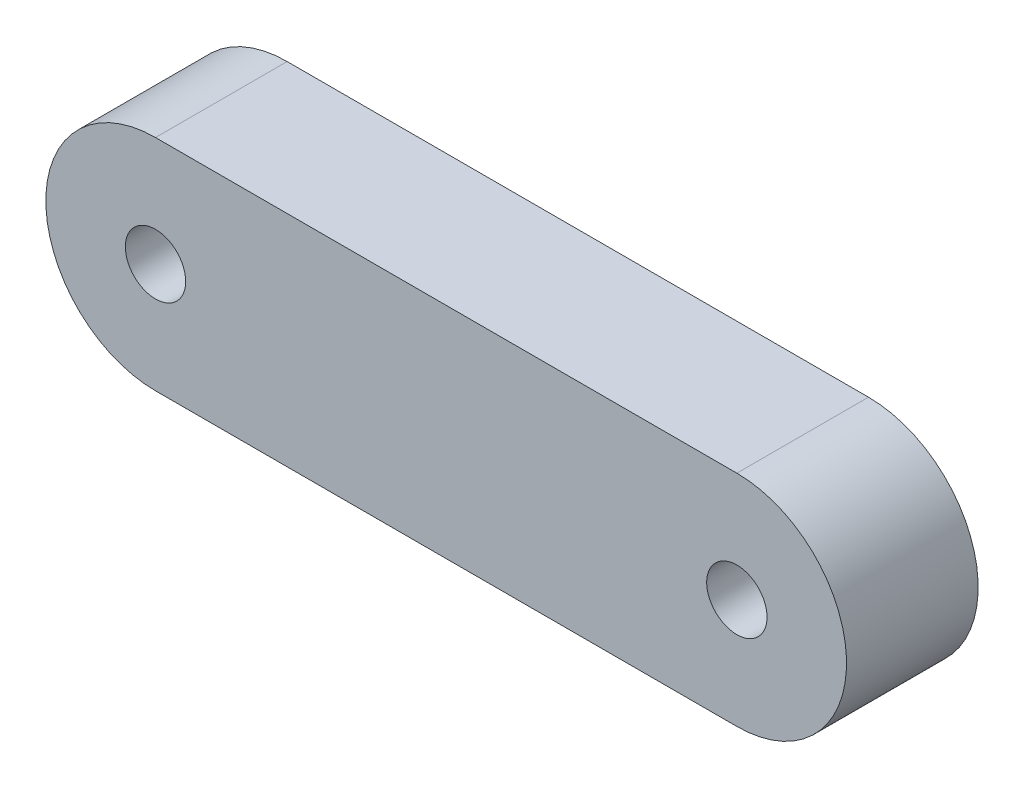
ISO-10303-21;
HEADER;
FILE_DESCRIPTION(('STEP AP214'),'2;1');
FILE_NAME('part.step','',(''),(''),'','','');
FILE_SCHEMA(('AUTOMOTIVE_DESIGN { 1 0 10303 214 1 1 1 1 }'));
ENDSEC;
DATA;
#1=APPLICATION_CONTEXT('core data for automotive mechanical design processes');
#2=APPLICATION_PROTOCOL_DEFINITION('international standard','automotive_design',2000,#1);
#3=PRODUCT_CONTEXT('',#1,'mechanical');
#4=PRODUCT('Part','Part','',(#3));
#5=PRODUCT_RELATED_PRODUCT_CATEGORY('part','',(#4));
#6=PRODUCT_DEFINITION_FORMATION('','',#4);
#7=PRODUCT_DEFINITION_CONTEXT('part definition',#1,'design');
#8=PRODUCT_DEFINITION('design','',#6,#7);
#9=PRODUCT_DEFINITION_SHAPE('','',#8);
#10=(LENGTH_UNIT() NAMED_UNIT(*) SI_UNIT(.MILLI.,.METRE.));
#11=(NAMED_UNIT(*) PLANE_ANGLE_UNIT() SI_UNIT($,.RADIAN.));
#12=(NAMED_UNIT(*) SI_UNIT($,.STERADIAN.) SOLID_ANGLE_UNIT());
#13=UNCERTAINTY_MEASURE_WITH_UNIT(LENGTH_MEASURE(1.E-05),#10,'distance_accuracy_value','');
#14=(GEOMETRIC_REPRESENTATION_CONTEXT(3) GLOBAL_UNCERTAINTY_ASSIGNED_CONTEXT((#13)) GLOBAL_UNIT_ASSIGNED_CONTEXT((#10,
#11,#12)) REPRESENTATION_CONTEXT('',''));
#15=CARTESIAN_POINT('',(0.,0.,0.));
#16=DIRECTION('',(0.,0.,1.));
#17=DIRECTION('',(1.,0.,0.));
#18=AXIS2_PLACEMENT_3D('',#15,#16,#17);
#19=CARTESIAN_POINT('',(0.,0.,12.));
#20=DIRECTION('',(0.,0.,1.));
#21=DIRECTION('',(1.,0.,0.));
#22=AXIS2_PLACEMENT_3D('',#19,#20,#21);
#23=PLANE('',#22);
#24=CARTESIAN_POINT('',(-53.,0.,12.));
#25=DIRECTION('',(0.,0.,1.));
#26=DIRECTION('',(1.,0.,0.));
#27=AXIS2_PLACEMENT_3D('',#24,#25,#26);
#28=CIRCLE('',#27,2.74999999999994);
#29=CARTESIAN_POINT('',(-50.2500000000001,0.,12.));
#30=VERTEX_POINT('',#29);
#31=EDGE_CURVE('E112',#30,#30,#28,.T.);
#32=ORIENTED_EDGE('',*,*,#31,.F.);
#33=EDGE_LOOP('',(#32));
#34=FACE_BOUND('',#33,.T.);
#35=CARTESIAN_POINT('',(0.,0.,12.));
#36=DIRECTION('',(0.,0.,1.));
#37=DIRECTION('',(1.,0.,0.));
#38=AXIS2_PLACEMENT_3D('',#35,#36,#37);
#39=CIRCLE('',#38,10.);
#40=CARTESIAN_POINT('',(0.,-10.,12.));
#41=VERTEX_POINT('',#40);
#42=CARTESIAN_POINT('',(0.,10.,12.));
#43=VERTEX_POINT('',#42);
#44=EDGE_CURVE('E92',#41,#43,#39,.T.);
#45=ORIENTED_EDGE('',*,*,#44,.T.);
#46=DIRECTION('',(-1.,0.,0.));
#47=VECTOR('',#46,1.);
#48=CARTESIAN_POINT('',(0.,10.,12.));
#49=LINE('',#48,#47);
#50=CARTESIAN_POINT('',(-53.,9.99999999999999,12.));
#51=VERTEX_POINT('',#50);
#52=EDGE_CURVE('E87',#43,#51,#49,.T.);
#53=ORIENTED_EDGE('',*,*,#52,.T.);
#54=CARTESIAN_POINT('',(-53.,0.,12.));
#55=DIRECTION('',(0.,0.,1.));
#56=DIRECTION('',(1.,0.,0.));
#57=AXIS2_PLACEMENT_3D('',#54,#55,#56);
#58=CIRCLE('',#57,10.);
#59=CARTESIAN_POINT('',(-53.,-10.,12.));
#60=VERTEX_POINT('',#59);
#61=EDGE_CURVE('E90',#51,#60,#58,.T.);
#62=ORIENTED_EDGE('',*,*,#61,.T.);
#63=DIRECTION('',(1.,0.,0.));
#64=VECTOR('',#63,1.);
#65=CARTESIAN_POINT('',(0.,-10.,12.));
#66=LINE('',#65,#64);
#67=EDGE_CURVE('E57',#60,#41,#66,.T.);
#68=ORIENTED_EDGE('',*,*,#67,.T.);
#69=EDGE_LOOP('',(#45,#53,#62,#68));
#70=FACE_BOUND('',#69,.T.);
#71=CARTESIAN_POINT('',(0.,0.,12.));
#72=DIRECTION('',(0.,0.,1.));
#73=DIRECTION('',(1.,0.,0.));
#74=AXIS2_PLACEMENT_3D('',#71,#72,#73);
#75=CIRCLE('',#74,2.75);
#76=CARTESIAN_POINT('',(2.75,0.,12.));
#77=VERTEX_POINT('',#76);
#78=EDGE_CURVE('E134',#77,#77,#75,.T.);
#79=ORIENTED_EDGE('',*,*,#78,.F.);
#80=EDGE_LOOP('',(#79));
#81=FACE_BOUND('',#80,.T.);
#82=ADVANCED_FACE('F39',(#34,#70,#81),#23,.T.);
#83=CARTESIAN_POINT('',(0.,0.,0.));
#84=DIRECTION('',(0.,0.,1.));
#85=DIRECTION('',(1.,0.,0.));
#86=AXIS2_PLACEMENT_3D('',#83,#84,#85);
#87=PLANE('',#86);
#88=CARTESIAN_POINT('',(0.,0.,0.));
#89=DIRECTION('',(0.,0.,1.));
#90=DIRECTION('',(1.,0.,0.));
#91=AXIS2_PLACEMENT_3D('',#88,#89,#90);
#92=CIRCLE('',#91,10.);
#93=CARTESIAN_POINT('',(0.,-10.,0.));
#94=VERTEX_POINT('',#93);
#95=CARTESIAN_POINT('',(0.,10.,0.));
#96=VERTEX_POINT('',#95);
#97=EDGE_CURVE('E108',#94,#96,#92,.T.);
#98=ORIENTED_EDGE('',*,*,#97,.F.);
#99=DIRECTION('',(1.,0.,0.));
#100=VECTOR('',#99,1.);
#101=CARTESIAN_POINT('',(0.,-10.,0.));
#102=LINE('',#101,#100);
#103=CARTESIAN_POINT('',(-53.,-10.,0.));
#104=VERTEX_POINT('',#103);
#105=EDGE_CURVE('E80',#104,#94,#102,.T.);
#106=ORIENTED_EDGE('',*,*,#105,.F.);
#107=CARTESIAN_POINT('',(-53.,0.,0.));
#108=DIRECTION('',(0.,0.,1.));
#109=DIRECTION('',(1.,0.,0.));
#110=AXIS2_PLACEMENT_3D('',#107,#108,#109);
#111=CIRCLE('',#110,10.);
#112=CARTESIAN_POINT('',(-53.,9.99999999999999,0.));
#113=VERTEX_POINT('',#112);
#114=EDGE_CURVE('E74',#113,#104,#111,.T.);
#115=ORIENTED_EDGE('',*,*,#114,.F.);
#116=DIRECTION('',(-1.,0.,0.));
#117=VECTOR('',#116,1.);
#118=CARTESIAN_POINT('',(0.,10.,0.));
#119=LINE('',#118,#117);
#120=EDGE_CURVE('E97',#96,#113,#119,.T.);
#121=ORIENTED_EDGE('',*,*,#120,.F.);
#122=EDGE_LOOP('',(#98,#106,#115,#121));
#123=FACE_BOUND('',#122,.T.);
#124=CARTESIAN_POINT('',(-53.,0.,0.));
#125=DIRECTION('',(0.,0.,1.));
#126=DIRECTION('',(1.,0.,0.));
#127=AXIS2_PLACEMENT_3D('',#124,#125,#126);
#128=CIRCLE('',#127,2.74999999999994);
#129=CARTESIAN_POINT('',(-50.2500000000001,0.,0.));
#130=VERTEX_POINT('',#129);
#131=EDGE_CURVE('E130',#130,#130,#128,.T.);
#132=ORIENTED_EDGE('',*,*,#131,.T.);
#133=EDGE_LOOP('',(#132));
#134=FACE_BOUND('',#133,.T.);
#135=CARTESIAN_POINT('',(0.,0.,0.));
#136=DIRECTION('',(0.,0.,1.));
#137=DIRECTION('',(1.,0.,0.));
#138=AXIS2_PLACEMENT_3D('',#135,#136,#137);
#139=CIRCLE('',#138,2.75);
#140=CARTESIAN_POINT('',(2.75,0.,0.));
#141=VERTEX_POINT('',#140);
#142=EDGE_CURVE('E138',#141,#141,#139,.T.);
#143=ORIENTED_EDGE('',*,*,#142,.T.);
#144=EDGE_LOOP('',(#143));
#145=FACE_BOUND('',#144,.T.);
#146=ADVANCED_FACE('F125',(#123,#134,#145),#87,.F.);
#147=CARTESIAN_POINT('',(0.,0.,12.));
#148=DIRECTION('',(0.,0.,-1.));
#149=DIRECTION('',(-1.,0.,0.));
#150=AXIS2_PLACEMENT_3D('',#147,#148,#149);
#151=CYLINDRICAL_SURFACE('',#150,10.);
#152=ORIENTED_EDGE('',*,*,#97,.T.);
#153=DIRECTION('',(0.,0.,-1.));
#154=VECTOR('',#153,1.);
#155=CARTESIAN_POINT('',(0.,10.,12.));
#156=LINE('',#155,#154);
#157=EDGE_CURVE('E11',#43,#96,#156,.T.);
#158=ORIENTED_EDGE('',*,*,#157,.F.);
#159=ORIENTED_EDGE('',*,*,#44,.F.);
#160=DIRECTION('',(0.,0.,-1.));
#161=VECTOR('',#160,1.);
#162=CARTESIAN_POINT('',(0.,-10.,12.));
#163=LINE('',#162,#161);
#164=EDGE_CURVE('E104',#41,#94,#163,.T.);
#165=ORIENTED_EDGE('',*,*,#164,.T.);
#166=EDGE_LOOP('',(#152,#158,#159,#165));
#167=FACE_BOUND('',#166,.T.);
#168=ADVANCED_FACE('F41',(#167),#151,.T.);
#169=CARTESIAN_POINT('',(0.,10.,12.));
#170=DIRECTION('',(0.,-1.,0.));
#171=DIRECTION('',(1.,0.,0.));
#172=AXIS2_PLACEMENT_3D('',#169,#170,#171);
#173=PLANE('',#172);
#174=ORIENTED_EDGE('',*,*,#120,.T.);
#175=DIRECTION('',(0.,0.,-1.));
#176=VECTOR('',#175,1.);
#177=CARTESIAN_POINT('',(-53.,9.99999999999999,12.));
#178=LINE('',#177,#176);
#179=EDGE_CURVE('E49',#51,#113,#178,.T.);
#180=ORIENTED_EDGE('',*,*,#179,.F.);
#181=ORIENTED_EDGE('',*,*,#52,.F.);
#182=ORIENTED_EDGE('',*,*,#157,.T.);
#183=EDGE_LOOP('',(#174,#180,#181,#182));
#184=FACE_BOUND('',#183,.T.);
#185=ADVANCED_FACE('F96',(#184),#173,.F.);
#186=CARTESIAN_POINT('',(-53.,0.,12.));
#187=DIRECTION('',(0.,0.,-1.));
#188=DIRECTION('',(-1.,0.,0.));
#189=AXIS2_PLACEMENT_3D('',#186,#187,#188);
#190=CYLINDRICAL_SURFACE('',#189,10.);
#191=ORIENTED_EDGE('',*,*,#114,.T.);
#192=DIRECTION('',(0.,0.,-1.));
#193=VECTOR('',#192,1.);
#194=CARTESIAN_POINT('',(-53.,-10.,12.));
#195=LINE('',#194,#193);
#196=EDGE_CURVE('E99',#60,#104,#195,.T.);
#197=ORIENTED_EDGE('',*,*,#196,.F.);
#198=ORIENTED_EDGE('',*,*,#61,.F.);
#199=ORIENTED_EDGE('',*,*,#179,.T.);
#200=EDGE_LOOP('',(#191,#197,#198,#199));
#201=FACE_BOUND('',#200,.T.);
#202=ADVANCED_FACE('F100',(#201),#190,.T.);
#203=CARTESIAN_POINT('',(0.,-10.,12.));
#204=DIRECTION('',(0.,1.,0.));
#205=DIRECTION('',(-1.,0.,0.));
#206=AXIS2_PLACEMENT_3D('',#203,#204,#205);
#207=PLANE('',#206);
#208=ORIENTED_EDGE('',*,*,#105,.T.);
#209=ORIENTED_EDGE('',*,*,#164,.F.);
#210=ORIENTED_EDGE('',*,*,#67,.F.);
#211=ORIENTED_EDGE('',*,*,#196,.T.);
#212=EDGE_LOOP('',(#208,#209,#210,#211));
#213=FACE_BOUND('',#212,.T.);
#214=ADVANCED_FACE('F122',(#213),#207,.F.);
#215=CARTESIAN_POINT('',(-53.,0.,12.));
#216=DIRECTION('',(0.,0.,-1.));
#217=DIRECTION('',(-1.,0.,0.));
#218=AXIS2_PLACEMENT_3D('',#215,#216,#217);
#219=CYLINDRICAL_SURFACE('',#218,2.74999999999994);
#220=ORIENTED_EDGE('',*,*,#31,.T.);
#221=EDGE_LOOP('',(#220));
#222=FACE_BOUND('',#221,.T.);
#223=ORIENTED_EDGE('',*,*,#131,.F.);
#224=EDGE_LOOP('',(#223));
#225=FACE_BOUND('',#224,.T.);
#226=ADVANCED_FACE('F157',(#222,#225),#219,.F.);
#227=CARTESIAN_POINT('',(0.,0.,12.));
#228=DIRECTION('',(0.,0.,-1.));
#229=DIRECTION('',(-1.,0.,0.));
#230=AXIS2_PLACEMENT_3D('',#227,#228,#229);
#231=CYLINDRICAL_SURFACE('',#230,2.75);
#232=ORIENTED_EDGE('',*,*,#78,.T.);
#233=EDGE_LOOP('',(#232));
#234=FACE_BOUND('',#233,.T.);
#235=ORIENTED_EDGE('',*,*,#142,.F.);
#236=EDGE_LOOP('',(#235));
#237=FACE_BOUND('',#236,.T.);
#238=ADVANCED_FACE('F146',(#234,#237),#231,.F.);
#239=CLOSED_SHELL('',(#82,#146,#168,#185,#202,#214,#226,#238));
#240=MANIFOLD_SOLID_BREP('B2',#239);
#241=ADVANCED_BREP_SHAPE_REPRESENTATION('',(#18,#240),#14);
#242=SHAPE_DEFINITION_REPRESENTATION(#9,#241);
ENDSEC;
END-ISO-10303-21;
